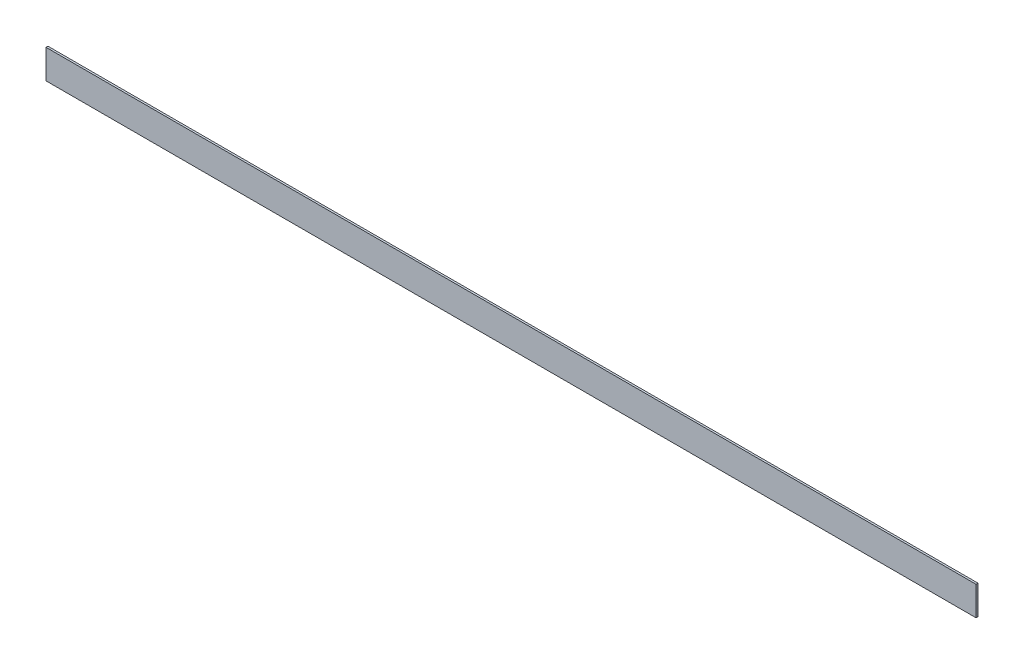
ISO-10303-21;
HEADER;
FILE_DESCRIPTION(('STEP AP214'),'2;1');
FILE_NAME('part.step','',(''),(''),'','','');
FILE_SCHEMA(('AUTOMOTIVE_DESIGN { 1 0 10303 214 1 1 1 1 }'));
ENDSEC;
DATA;
#1=APPLICATION_CONTEXT('core data for automotive mechanical design processes');
#2=APPLICATION_PROTOCOL_DEFINITION('international standard','automotive_design',2000,#1);
#3=PRODUCT_CONTEXT('',#1,'mechanical');
#4=PRODUCT('Part','Part','',(#3));
#5=PRODUCT_RELATED_PRODUCT_CATEGORY('part','',(#4));
#6=PRODUCT_DEFINITION_FORMATION('','',#4);
#7=PRODUCT_DEFINITION_CONTEXT('part definition',#1,'design');
#8=PRODUCT_DEFINITION('design','',#6,#7);
#9=PRODUCT_DEFINITION_SHAPE('','',#8);
#10=(LENGTH_UNIT() NAMED_UNIT(*) SI_UNIT(.MILLI.,.METRE.));
#11=(NAMED_UNIT(*) PLANE_ANGLE_UNIT() SI_UNIT($,.RADIAN.));
#12=(NAMED_UNIT(*) SI_UNIT($,.STERADIAN.) SOLID_ANGLE_UNIT());
#13=UNCERTAINTY_MEASURE_WITH_UNIT(LENGTH_MEASURE(1.E-05),#10,'distance_accuracy_value','');
#14=(GEOMETRIC_REPRESENTATION_CONTEXT(3) GLOBAL_UNCERTAINTY_ASSIGNED_CONTEXT((#13)) GLOBAL_UNIT_ASSIGNED_CONTEXT((#10,
#11,#12)) REPRESENTATION_CONTEXT('',''));
#15=CARTESIAN_POINT('',(0.,0.,0.));
#16=DIRECTION('',(0.,0.,1.));
#17=DIRECTION('',(1.,0.,0.));
#18=AXIS2_PLACEMENT_3D('',#15,#16,#17);
#19=CARTESIAN_POINT('',(0.,0.,1.27));
#20=DIRECTION('',(1.,0.,0.));
#21=DIRECTION('',(0.,0.,-1.));
#22=AXIS2_PLACEMENT_3D('',#19,#20,#21);
#23=PLANE('',#22);
#24=DIRECTION('',(0.,-1.,0.));
#25=VECTOR('',#24,1.);
#26=CARTESIAN_POINT('',(0.,0.,0.));
#27=LINE('',#26,#25);
#28=CARTESIAN_POINT('',(0.,19.05,0.));
#29=VERTEX_POINT('',#28);
#30=CARTESIAN_POINT('',(0.,0.,0.));
#31=VERTEX_POINT('',#30);
#32=EDGE_CURVE('E97',#29,#31,#27,.T.);
#33=ORIENTED_EDGE('',*,*,#32,.T.);
#34=DIRECTION('',(0.,0.,-1.));
#35=VECTOR('',#34,1.);
#36=CARTESIAN_POINT('',(0.,0.,1.27));
#37=LINE('',#36,#35);
#38=CARTESIAN_POINT('',(0.,0.,1.27));
#39=VERTEX_POINT('',#38);
#40=EDGE_CURVE('E11',#39,#31,#37,.T.);
#41=ORIENTED_EDGE('',*,*,#40,.F.);
#42=DIRECTION('',(0.,-1.,0.));
#43=VECTOR('',#42,1.);
#44=CARTESIAN_POINT('',(0.,0.,1.27));
#45=LINE('',#44,#43);
#46=CARTESIAN_POINT('',(0.,19.05,1.27));
#47=VERTEX_POINT('',#46);
#48=EDGE_CURVE('E85',#47,#39,#45,.T.);
#49=ORIENTED_EDGE('',*,*,#48,.F.);
#50=DIRECTION('',(0.,0.,-1.));
#51=VECTOR('',#50,1.);
#52=CARTESIAN_POINT('',(0.,19.05,1.27));
#53=LINE('',#52,#51);
#54=EDGE_CURVE('E93',#47,#29,#53,.T.);
#55=ORIENTED_EDGE('',*,*,#54,.T.);
#56=EDGE_LOOP('',(#33,#41,#49,#55));
#57=FACE_BOUND('',#56,.T.);
#58=ADVANCED_FACE('F34',(#57),#23,.F.);
#59=CARTESIAN_POINT('',(0.,0.,1.27));
#60=DIRECTION('',(0.,1.,0.));
#61=DIRECTION('',(0.,0.,1.));
#62=AXIS2_PLACEMENT_3D('',#59,#60,#61);
#63=PLANE('',#62);
#64=DIRECTION('',(1.,0.,0.));
#65=VECTOR('',#64,1.);
#66=CARTESIAN_POINT('',(0.,0.,0.));
#67=LINE('',#66,#65);
#68=CARTESIAN_POINT('',(609.6,0.,0.));
#69=VERTEX_POINT('',#68);
#70=EDGE_CURVE('E89',#31,#69,#67,.T.);
#71=ORIENTED_EDGE('',*,*,#70,.T.);
#72=DIRECTION('',(0.,0.,-1.));
#73=VECTOR('',#72,1.);
#74=CARTESIAN_POINT('',(609.6,0.,1.27));
#75=LINE('',#74,#73);
#76=CARTESIAN_POINT('',(609.6,0.,1.27));
#77=VERTEX_POINT('',#76);
#78=EDGE_CURVE('E42',#77,#69,#75,.T.);
#79=ORIENTED_EDGE('',*,*,#78,.F.);
#80=DIRECTION('',(1.,0.,0.));
#81=VECTOR('',#80,1.);
#82=CARTESIAN_POINT('',(0.,0.,1.27));
#83=LINE('',#82,#81);
#84=EDGE_CURVE('E80',#39,#77,#83,.T.);
#85=ORIENTED_EDGE('',*,*,#84,.F.);
#86=ORIENTED_EDGE('',*,*,#40,.T.);
#87=EDGE_LOOP('',(#71,#79,#85,#86));
#88=FACE_BOUND('',#87,.T.);
#89=ADVANCED_FACE('F88',(#88),#63,.F.);
#90=CARTESIAN_POINT('',(609.6,0.,1.27));
#91=DIRECTION('',(-1.,0.,0.));
#92=DIRECTION('',(0.,0.,1.));
#93=AXIS2_PLACEMENT_3D('',#90,#91,#92);
#94=PLANE('',#93);
#95=DIRECTION('',(0.,1.,0.));
#96=VECTOR('',#95,1.);
#97=CARTESIAN_POINT('',(609.6,0.,0.));
#98=LINE('',#97,#96);
#99=CARTESIAN_POINT('',(609.6,19.05,0.));
#100=VERTEX_POINT('',#99);
#101=EDGE_CURVE('E67',#69,#100,#98,.T.);
#102=ORIENTED_EDGE('',*,*,#101,.T.);
#103=DIRECTION('',(0.,0.,-1.));
#104=VECTOR('',#103,1.);
#105=CARTESIAN_POINT('',(609.6,19.05,1.27));
#106=LINE('',#105,#104);
#107=CARTESIAN_POINT('',(609.6,19.05,1.27));
#108=VERTEX_POINT('',#107);
#109=EDGE_CURVE('E90',#108,#100,#106,.T.);
#110=ORIENTED_EDGE('',*,*,#109,.F.);
#111=DIRECTION('',(0.,1.,0.));
#112=VECTOR('',#111,1.);
#113=CARTESIAN_POINT('',(609.6,0.,1.27));
#114=LINE('',#113,#112);
#115=EDGE_CURVE('E83',#77,#108,#114,.T.);
#116=ORIENTED_EDGE('',*,*,#115,.F.);
#117=ORIENTED_EDGE('',*,*,#78,.T.);
#118=EDGE_LOOP('',(#102,#110,#116,#117));
#119=FACE_BOUND('',#118,.T.);
#120=ADVANCED_FACE('F91',(#119),#94,.F.);
#121=CARTESIAN_POINT('',(0.,19.05,1.27));
#122=DIRECTION('',(0.,-1.,0.));
#123=DIRECTION('',(0.,0.,-1.));
#124=AXIS2_PLACEMENT_3D('',#121,#122,#123);
#125=PLANE('',#124);
#126=DIRECTION('',(-1.,0.,0.));
#127=VECTOR('',#126,1.);
#128=CARTESIAN_POINT('',(0.,19.05,0.));
#129=LINE('',#128,#127);
#130=EDGE_CURVE('E73',#100,#29,#129,.T.);
#131=ORIENTED_EDGE('',*,*,#130,.T.);
#132=ORIENTED_EDGE('',*,*,#54,.F.);
#133=DIRECTION('',(-1.,0.,0.));
#134=VECTOR('',#133,1.);
#135=CARTESIAN_POINT('',(0.,19.05,1.27));
#136=LINE('',#135,#134);
#137=EDGE_CURVE('E50',#108,#47,#136,.T.);
#138=ORIENTED_EDGE('',*,*,#137,.F.);
#139=ORIENTED_EDGE('',*,*,#109,.T.);
#140=EDGE_LOOP('',(#131,#132,#138,#139));
#141=FACE_BOUND('',#140,.T.);
#142=ADVANCED_FACE('F104',(#141),#125,.F.);
#143=CARTESIAN_POINT('',(0.,0.,1.27));
#144=DIRECTION('',(0.,0.,-1.));
#145=DIRECTION('',(-1.,0.,0.));
#146=AXIS2_PLACEMENT_3D('',#143,#144,#145);
#147=PLANE('',#146);
#148=ORIENTED_EDGE('',*,*,#48,.T.);
#149=ORIENTED_EDGE('',*,*,#84,.T.);
#150=ORIENTED_EDGE('',*,*,#115,.T.);
#151=ORIENTED_EDGE('',*,*,#137,.T.);
#152=EDGE_LOOP('',(#148,#149,#150,#151));
#153=FACE_BOUND('',#152,.T.);
#154=ADVANCED_FACE('F81',(#153),#147,.F.);
#155=CARTESIAN_POINT('',(0.,0.,0.));
#156=DIRECTION('',(0.,0.,-1.));
#157=DIRECTION('',(-1.,0.,0.));
#158=AXIS2_PLACEMENT_3D('',#155,#156,#157);
#159=PLANE('',#158);
#160=ORIENTED_EDGE('',*,*,#32,.F.);
#161=ORIENTED_EDGE('',*,*,#130,.F.);
#162=ORIENTED_EDGE('',*,*,#101,.F.);
#163=ORIENTED_EDGE('',*,*,#70,.F.);
#164=EDGE_LOOP('',(#160,#161,#162,#163));
#165=FACE_BOUND('',#164,.T.);
#166=ADVANCED_FACE('F107',(#165),#159,.T.);
#167=CLOSED_SHELL('',(#58,#89,#120,#142,#154,#166));
#168=MANIFOLD_SOLID_BREP('B2',#167);
#169=ADVANCED_BREP_SHAPE_REPRESENTATION('',(#18,#168),#14);
#170=SHAPE_DEFINITION_REPRESENTATION(#9,#169);
ENDSEC;
END-ISO-10303-21;
